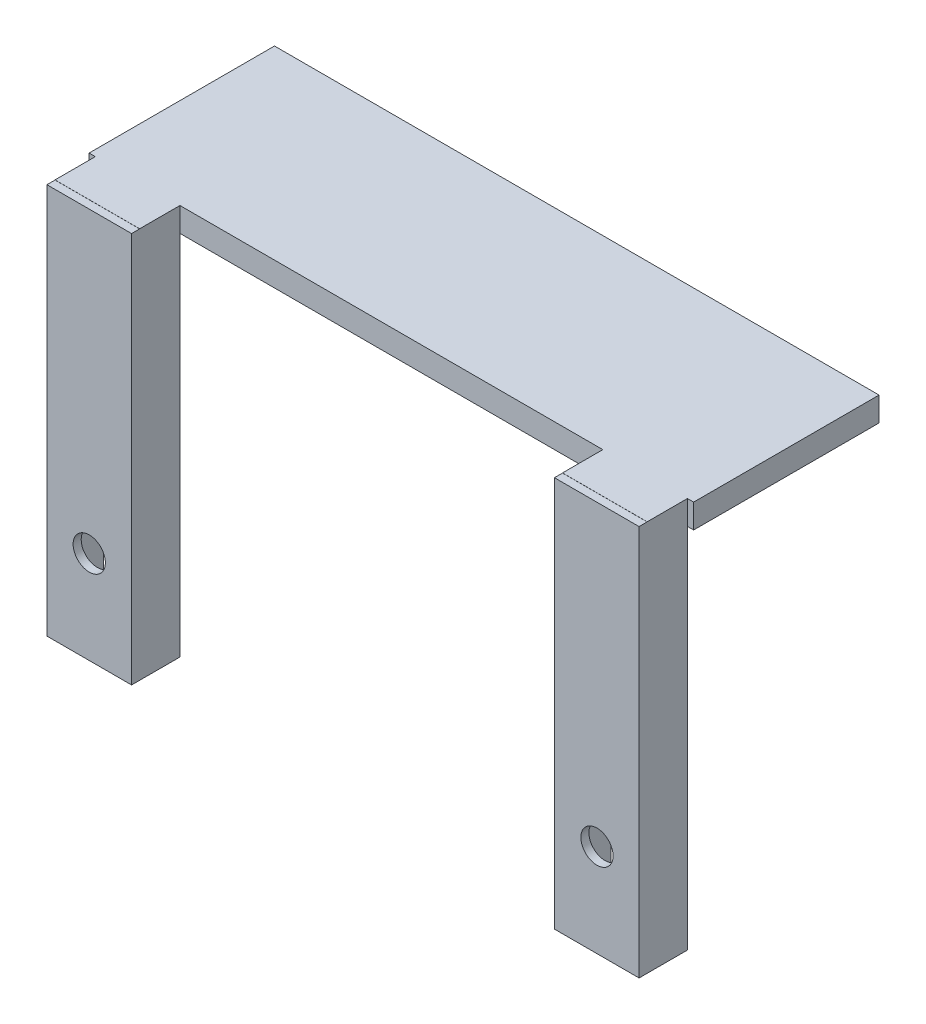
ISO-10303-21;
HEADER;
FILE_DESCRIPTION(('STEP AP214'),'2;1');
FILE_NAME('part.step','',(''),(''),'','','');
FILE_SCHEMA(('AUTOMOTIVE_DESIGN { 1 0 10303 214 1 1 1 1 }'));
ENDSEC;
DATA;
#1=APPLICATION_CONTEXT('core data for automotive mechanical design processes');
#2=APPLICATION_PROTOCOL_DEFINITION('international standard','automotive_design',2000,#1);
#3=PRODUCT_CONTEXT('',#1,'mechanical');
#4=PRODUCT('Part','Part','',(#3));
#5=PRODUCT_RELATED_PRODUCT_CATEGORY('part','',(#4));
#6=PRODUCT_DEFINITION_FORMATION('','',#4);
#7=PRODUCT_DEFINITION_CONTEXT('part definition',#1,'design');
#8=PRODUCT_DEFINITION('design','',#6,#7);
#9=PRODUCT_DEFINITION_SHAPE('','',#8);
#10=(LENGTH_UNIT() NAMED_UNIT(*) SI_UNIT(.MILLI.,.METRE.));
#11=(NAMED_UNIT(*) PLANE_ANGLE_UNIT() SI_UNIT($,.RADIAN.));
#12=(NAMED_UNIT(*) SI_UNIT($,.STERADIAN.) SOLID_ANGLE_UNIT());
#13=UNCERTAINTY_MEASURE_WITH_UNIT(LENGTH_MEASURE(1.E-05),#10,'distance_accuracy_value','');
#14=(GEOMETRIC_REPRESENTATION_CONTEXT(3) GLOBAL_UNCERTAINTY_ASSIGNED_CONTEXT((#13)) GLOBAL_UNIT_ASSIGNED_CONTEXT((#10,
#11,#12)) REPRESENTATION_CONTEXT('',''));
#15=CARTESIAN_POINT('',(0.,0.,0.));
#16=DIRECTION('',(0.,0.,1.));
#17=DIRECTION('',(1.,0.,0.));
#18=AXIS2_PLACEMENT_3D('',#15,#16,#17);
#19=CARTESIAN_POINT('',(0.,0.,16.5));
#20=DIRECTION('',(0.,0.,1.));
#21=DIRECTION('',(1.,0.,0.));
#22=AXIS2_PLACEMENT_3D('',#19,#20,#21);
#23=PLANE('',#22);
#24=DIRECTION('',(0.,-1.,0.));
#25=VECTOR('',#24,1.);
#26=CARTESIAN_POINT('',(26.2302574308606,-45.51489046248,16.5));
#27=LINE('',#26,#25);
#28=CARTESIAN_POINT('',(26.2302574308606,3.00000000000037,16.5));
#29=VERTEX_POINT('',#28);
#30=CARTESIAN_POINT('',(26.2302574308606,2.98510953751964,16.5));
#31=VERTEX_POINT('',#30);
#32=EDGE_CURVE('E64',#29,#31,#27,.T.);
#33=ORIENTED_EDGE('',*,*,#32,.T.);
#34=DIRECTION('',(1.,0.,0.));
#35=VECTOR('',#34,1.);
#36=CARTESIAN_POINT('',(26.2302574308606,2.98510953751964,16.5));
#37=LINE('',#36,#35);
#38=CARTESIAN_POINT('',(36.7302574308606,2.98510953751964,16.5));
#39=VERTEX_POINT('',#38);
#40=EDGE_CURVE('E68',#31,#39,#37,.T.);
#41=ORIENTED_EDGE('',*,*,#40,.T.);
#42=DIRECTION('',(0.,1.,0.));
#43=VECTOR('',#42,1.);
#44=CARTESIAN_POINT('',(36.7302574308606,3.00000000000037,16.5));
#45=LINE('',#44,#43);
#46=CARTESIAN_POINT('',(36.7302574308606,3.00000000000037,16.5));
#47=VERTEX_POINT('',#46);
#48=EDGE_CURVE('E428',#39,#47,#45,.T.);
#49=ORIENTED_EDGE('',*,*,#48,.T.);
#50=DIRECTION('',(-1.,0.,0.));
#51=VECTOR('',#50,1.);
#52=CARTESIAN_POINT('',(26.2302574308606,3.00000000000037,16.5));
#53=LINE('',#52,#51);
#54=EDGE_CURVE('E425',#47,#29,#53,.T.);
#55=ORIENTED_EDGE('',*,*,#54,.T.);
#56=EDGE_LOOP('',(#33,#41,#49,#55));
#57=FACE_BOUND('',#56,.T.);
#58=ADVANCED_FACE('F45',(#57),#23,.T.);
#59=CARTESIAN_POINT('',(0.,0.,16.5));
#60=DIRECTION('',(0.,0.,-1.));
#61=DIRECTION('',(-1.,0.,0.));
#62=AXIS2_PLACEMENT_3D('',#59,#60,#61);
#63=PLANE('',#62);
#64=DIRECTION('',(1.,0.,0.));
#65=VECTOR('',#64,1.);
#66=CARTESIAN_POINT('',(-36.73025743086,2.98510953751964,16.5));
#67=LINE('',#66,#65);
#68=CARTESIAN_POINT('',(-36.73025743086,2.98510953751964,16.5));
#69=VERTEX_POINT('',#68);
#70=CARTESIAN_POINT('',(-26.23025743086,2.98510953751964,16.5));
#71=VERTEX_POINT('',#70);
#72=EDGE_CURVE('E244',#69,#71,#67,.T.);
#73=ORIENTED_EDGE('',*,*,#72,.T.);
#74=DIRECTION('',(0.,1.,0.));
#75=VECTOR('',#74,1.);
#76=CARTESIAN_POINT('',(-26.23025743086,-45.5148904624804,16.5));
#77=LINE('',#76,#75);
#78=CARTESIAN_POINT('',(-26.23025743086,3.,16.5));
#79=VERTEX_POINT('',#78);
#80=EDGE_CURVE('E240',#71,#79,#77,.T.);
#81=ORIENTED_EDGE('',*,*,#80,.T.);
#82=DIRECTION('',(-1.,0.,0.));
#83=VECTOR('',#82,1.);
#84=CARTESIAN_POINT('',(-26.23025743086,3.,16.5));
#85=LINE('',#84,#83);
#86=CARTESIAN_POINT('',(-36.73025743086,3.,16.5));
#87=VERTEX_POINT('',#86);
#88=EDGE_CURVE('E309',#79,#87,#85,.T.);
#89=ORIENTED_EDGE('',*,*,#88,.T.);
#90=DIRECTION('',(0.,-1.,0.));
#91=VECTOR('',#90,1.);
#92=CARTESIAN_POINT('',(-36.73025743086,3.,16.5));
#93=LINE('',#92,#91);
#94=EDGE_CURVE('E312',#87,#69,#93,.T.);
#95=ORIENTED_EDGE('',*,*,#94,.T.);
#96=EDGE_LOOP('',(#73,#81,#89,#95));
#97=FACE_BOUND('',#96,.T.);
#98=ADVANCED_FACE('F540',(#97),#63,.F.);
#99=CARTESIAN_POINT('',(-37.5,3.,11.5));
#100=DIRECTION('',(0.,0.,-1.));
#101=DIRECTION('',(-1.,0.,0.));
#102=AXIS2_PLACEMENT_3D('',#99,#100,#101);
#103=PLANE('',#102);
#104=DIRECTION('',(0.,-1.,0.));
#105=VECTOR('',#104,1.);
#106=CARTESIAN_POINT('',(-36.73025743086,3.,11.5));
#107=LINE('',#106,#105);
#108=CARTESIAN_POINT('',(-36.73025743086,3.,11.5));
#109=VERTEX_POINT('',#108);
#110=CARTESIAN_POINT('',(-36.73025743086,0.,11.5));
#111=VERTEX_POINT('',#110);
#112=EDGE_CURVE('E329',#109,#111,#107,.T.);
#113=ORIENTED_EDGE('',*,*,#112,.F.);
#114=DIRECTION('',(1.,0.,0.));
#115=VECTOR('',#114,1.);
#116=CARTESIAN_POINT('',(-37.5,3.,11.5));
#117=LINE('',#116,#115);
#118=CARTESIAN_POINT('',(-37.5,3.,11.5));
#119=VERTEX_POINT('',#118);
#120=EDGE_CURVE('E450',#119,#109,#117,.T.);
#121=ORIENTED_EDGE('',*,*,#120,.F.);
#122=DIRECTION('',(0.,-1.,0.));
#123=VECTOR('',#122,1.);
#124=CARTESIAN_POINT('',(-37.5,3.,11.5));
#125=LINE('',#124,#123);
#126=CARTESIAN_POINT('',(-37.5,0.,11.5));
#127=VERTEX_POINT('',#126);
#128=EDGE_CURVE('E473',#119,#127,#125,.T.);
#129=ORIENTED_EDGE('',*,*,#128,.T.);
#130=DIRECTION('',(1.,0.,0.));
#131=VECTOR('',#130,1.);
#132=CARTESIAN_POINT('',(-37.5,0.,11.5));
#133=LINE('',#132,#131);
#134=EDGE_CURVE('E443',#127,#111,#133,.T.);
#135=ORIENTED_EDGE('',*,*,#134,.T.);
#136=EDGE_LOOP('',(#113,#121,#129,#135));
#137=FACE_BOUND('',#136,.T.);
#138=ADVANCED_FACE('F633',(#137),#103,.F.);
#139=DIRECTION('',(0.,1.,0.));
#140=VECTOR('',#139,1.);
#141=CARTESIAN_POINT('',(-26.23025743086,-45.5148904624804,11.5));
#142=LINE('',#141,#140);
#143=CARTESIAN_POINT('',(-26.23025743086,0.,11.5));
#144=VERTEX_POINT('',#143);
#145=CARTESIAN_POINT('',(-26.23025743086,3.,11.5));
#146=VERTEX_POINT('',#145);
#147=EDGE_CURVE('E11',#144,#146,#142,.T.);
#148=ORIENTED_EDGE('',*,*,#147,.F.);
#149=CARTESIAN_POINT('',(26.2302574308606,0.,11.5));
#150=VERTEX_POINT('',#149);
#151=EDGE_CURVE('E522',#144,#150,#133,.T.);
#152=ORIENTED_EDGE('',*,*,#151,.T.);
#153=DIRECTION('',(0.,-1.,0.));
#154=VECTOR('',#153,1.);
#155=CARTESIAN_POINT('',(26.2302574308606,-45.51489046248,11.5));
#156=LINE('',#155,#154);
#157=CARTESIAN_POINT('',(26.2302574308606,3.,11.5));
#158=VERTEX_POINT('',#157);
#159=EDGE_CURVE('E407',#158,#150,#156,.T.);
#160=ORIENTED_EDGE('',*,*,#159,.F.);
#161=EDGE_CURVE('E455',#146,#158,#117,.T.);
#162=ORIENTED_EDGE('',*,*,#161,.F.);
#163=EDGE_LOOP('',(#148,#152,#160,#162));
#164=FACE_BOUND('',#163,.T.);
#165=ADVANCED_FACE('F642',(#164),#103,.F.);
#166=DIRECTION('',(0.,1.,0.));
#167=VECTOR('',#166,1.);
#168=CARTESIAN_POINT('',(36.7302574308606,3.00000000000037,11.5));
#169=LINE('',#168,#167);
#170=CARTESIAN_POINT('',(36.7302574308606,0.,11.5));
#171=VERTEX_POINT('',#170);
#172=CARTESIAN_POINT('',(36.7302574308606,3.00000000000037,11.5));
#173=VERTEX_POINT('',#172);
#174=EDGE_CURVE('E55',#171,#173,#169,.T.);
#175=ORIENTED_EDGE('',*,*,#174,.F.);
#176=CARTESIAN_POINT('',(37.5,0.,11.5));
#177=VERTEX_POINT('',#176);
#178=EDGE_CURVE('E465',#171,#177,#133,.T.);
#179=ORIENTED_EDGE('',*,*,#178,.T.);
#180=DIRECTION('',(0.,-1.,0.));
#181=VECTOR('',#180,1.);
#182=CARTESIAN_POINT('',(37.5,3.,11.5));
#183=LINE('',#182,#181);
#184=CARTESIAN_POINT('',(37.5,3.,11.5));
#185=VERTEX_POINT('',#184);
#186=EDGE_CURVE('E454',#185,#177,#183,.T.);
#187=ORIENTED_EDGE('',*,*,#186,.F.);
#188=EDGE_CURVE('E449',#173,#185,#117,.T.);
#189=ORIENTED_EDGE('',*,*,#188,.F.);
#190=EDGE_LOOP('',(#175,#179,#187,#189));
#191=FACE_BOUND('',#190,.T.);
#192=ADVANCED_FACE('F523',(#191),#103,.F.);
#193=CARTESIAN_POINT('',(37.5,3.,11.5));
#194=DIRECTION('',(-1.,0.,0.));
#195=DIRECTION('',(0.,0.,1.));
#196=AXIS2_PLACEMENT_3D('',#193,#194,#195);
#197=PLANE('',#196);
#198=DIRECTION('',(0.,0.,-1.));
#199=VECTOR('',#198,1.);
#200=CARTESIAN_POINT('',(37.5,0.,11.5));
#201=LINE('',#200,#199);
#202=CARTESIAN_POINT('',(37.5,0.,-11.5));
#203=VERTEX_POINT('',#202);
#204=EDGE_CURVE('E365',#177,#203,#201,.T.);
#205=ORIENTED_EDGE('',*,*,#204,.T.);
#206=DIRECTION('',(0.,-1.,0.));
#207=VECTOR('',#206,1.);
#208=CARTESIAN_POINT('',(37.5,3.,-11.5));
#209=LINE('',#208,#207);
#210=CARTESIAN_POINT('',(37.5,3.,-11.5));
#211=VERTEX_POINT('',#210);
#212=EDGE_CURVE('E49',#211,#203,#209,.T.);
#213=ORIENTED_EDGE('',*,*,#212,.F.);
#214=DIRECTION('',(0.,0.,-1.));
#215=VECTOR('',#214,1.);
#216=CARTESIAN_POINT('',(37.5,3.,11.5));
#217=LINE('',#216,#215);
#218=EDGE_CURVE('E438',#185,#211,#217,.T.);
#219=ORIENTED_EDGE('',*,*,#218,.F.);
#220=ORIENTED_EDGE('',*,*,#186,.T.);
#221=EDGE_LOOP('',(#205,#213,#219,#220));
#222=FACE_BOUND('',#221,.T.);
#223=ADVANCED_FACE('F47',(#222),#197,.F.);
#224=CARTESIAN_POINT('',(-37.5,3.,-11.5));
#225=DIRECTION('',(0.,0.,1.));
#226=DIRECTION('',(1.,0.,0.));
#227=AXIS2_PLACEMENT_3D('',#224,#225,#226);
#228=PLANE('',#227);
#229=DIRECTION('',(-1.,0.,0.));
#230=VECTOR('',#229,1.);
#231=CARTESIAN_POINT('',(-37.5,0.,-11.5));
#232=LINE('',#231,#230);
#233=CARTESIAN_POINT('',(-37.5,0.,-11.5));
#234=VERTEX_POINT('',#233);
#235=EDGE_CURVE('E459',#203,#234,#232,.T.);
#236=ORIENTED_EDGE('',*,*,#235,.T.);
#237=DIRECTION('',(0.,-1.,0.));
#238=VECTOR('',#237,1.);
#239=CARTESIAN_POINT('',(-37.5,3.,-11.5));
#240=LINE('',#239,#238);
#241=CARTESIAN_POINT('',(-37.5,3.,-11.5));
#242=VERTEX_POINT('',#241);
#243=EDGE_CURVE('E476',#242,#234,#240,.T.);
#244=ORIENTED_EDGE('',*,*,#243,.F.);
#245=DIRECTION('',(-1.,0.,0.));
#246=VECTOR('',#245,1.);
#247=CARTESIAN_POINT('',(-37.5,3.,-11.5));
#248=LINE('',#247,#246);
#249=EDGE_CURVE('E442',#211,#242,#248,.T.);
#250=ORIENTED_EDGE('',*,*,#249,.F.);
#251=ORIENTED_EDGE('',*,*,#212,.T.);
#252=EDGE_LOOP('',(#236,#244,#250,#251));
#253=FACE_BOUND('',#252,.T.);
#254=ADVANCED_FACE('F529',(#253),#228,.F.);
#255=CARTESIAN_POINT('',(-37.5,3.,11.5));
#256=DIRECTION('',(1.,0.,0.));
#257=DIRECTION('',(0.,0.,-1.));
#258=AXIS2_PLACEMENT_3D('',#255,#256,#257);
#259=PLANE('',#258);
#260=DIRECTION('',(0.,0.,1.));
#261=VECTOR('',#260,1.);
#262=CARTESIAN_POINT('',(-37.5,0.,11.5));
#263=LINE('',#262,#261);
#264=EDGE_CURVE('E462',#234,#127,#263,.T.);
#265=ORIENTED_EDGE('',*,*,#264,.T.);
#266=ORIENTED_EDGE('',*,*,#128,.F.);
#267=DIRECTION('',(0.,0.,1.));
#268=VECTOR('',#267,1.);
#269=CARTESIAN_POINT('',(-37.5,3.,11.5));
#270=LINE('',#269,#268);
#271=EDGE_CURVE('E446',#242,#119,#270,.T.);
#272=ORIENTED_EDGE('',*,*,#271,.F.);
#273=ORIENTED_EDGE('',*,*,#243,.T.);
#274=EDGE_LOOP('',(#265,#266,#272,#273));
#275=FACE_BOUND('',#274,.T.);
#276=ADVANCED_FACE('F531',(#275),#259,.F.);
#277=CARTESIAN_POINT('',(0.,3.,0.));
#278=DIRECTION('',(0.,-1.,0.));
#279=DIRECTION('',(0.,0.,-1.));
#280=AXIS2_PLACEMENT_3D('',#277,#278,#279);
#281=PLANE('',#280);
#282=ORIENTED_EDGE('',*,*,#218,.T.);
#283=ORIENTED_EDGE('',*,*,#249,.T.);
#284=ORIENTED_EDGE('',*,*,#271,.T.);
#285=ORIENTED_EDGE('',*,*,#120,.T.);
#286=DIRECTION('',(0.,0.,-1.));
#287=VECTOR('',#286,1.);
#288=CARTESIAN_POINT('',(-36.73025743086,3.,16.5));
#289=LINE('',#288,#287);
#290=EDGE_CURVE('E342',#87,#109,#289,.T.);
#291=ORIENTED_EDGE('',*,*,#290,.F.);
#292=ORIENTED_EDGE('',*,*,#88,.F.);
#293=DIRECTION('',(0.,0.,-1.));
#294=VECTOR('',#293,1.);
#295=CARTESIAN_POINT('',(-26.23025743086,3.,16.5));
#296=LINE('',#295,#294);
#297=EDGE_CURVE('E346',#79,#146,#296,.T.);
#298=ORIENTED_EDGE('',*,*,#297,.T.);
#299=ORIENTED_EDGE('',*,*,#161,.T.);
#300=DIRECTION('',(0.,0.,-1.));
#301=VECTOR('',#300,1.);
#302=CARTESIAN_POINT('',(26.2302574308606,3.00000000000037,16.5));
#303=LINE('',#302,#301);
#304=EDGE_CURVE('E381',#29,#158,#303,.T.);
#305=ORIENTED_EDGE('',*,*,#304,.F.);
#306=ORIENTED_EDGE('',*,*,#54,.F.);
#307=DIRECTION('',(0.,0.,-1.));
#308=VECTOR('',#307,1.);
#309=CARTESIAN_POINT('',(36.7302574308606,3.00000000000037,16.5));
#310=LINE('',#309,#308);
#311=EDGE_CURVE('E377',#47,#173,#310,.T.);
#312=ORIENTED_EDGE('',*,*,#311,.T.);
#313=ORIENTED_EDGE('',*,*,#188,.T.);
#314=EDGE_LOOP('',(#282,#283,#284,#285,#291,#292,#298,#299,#305,#306,#312,#313));
#315=FACE_BOUND('',#314,.T.);
#316=ADVANCED_FACE('F497',(#315),#281,.F.);
#317=CARTESIAN_POINT('',(0.,0.,0.));
#318=DIRECTION('',(0.,-1.,0.));
#319=DIRECTION('',(0.,0.,-1.));
#320=AXIS2_PLACEMENT_3D('',#317,#318,#319);
#321=PLANE('',#320);
#322=ORIENTED_EDGE('',*,*,#204,.F.);
#323=ORIENTED_EDGE('',*,*,#178,.F.);
#324=CARTESIAN_POINT('',(35.7302574308606,0.,11.5));
#325=VERTEX_POINT('',#324);
#326=EDGE_CURVE('E515',#325,#171,#133,.T.);
#327=ORIENTED_EDGE('',*,*,#326,.F.);
#328=DIRECTION('',(0.,0.,-1.));
#329=VECTOR('',#328,1.);
#330=CARTESIAN_POINT('',(35.7302574308606,3.82506526452886E-13,16.5));
#331=LINE('',#330,#329);
#332=CARTESIAN_POINT('',(35.7302574308606,3.82506526452886E-13,16.5));
#333=VERTEX_POINT('',#332);
#334=EDGE_CURVE('E262',#333,#325,#331,.T.);
#335=ORIENTED_EDGE('',*,*,#334,.F.);
#336=DIRECTION('',(1.,0.,0.));
#337=VECTOR('',#336,1.);
#338=CARTESIAN_POINT('',(35.7302574308606,3.82506526452886E-13,16.5));
#339=LINE('',#338,#337);
#340=CARTESIAN_POINT('',(27.2302574308606,3.82506526452886E-13,16.5));
#341=VERTEX_POINT('',#340);
#342=EDGE_CURVE('E403',#341,#333,#339,.T.);
#343=ORIENTED_EDGE('',*,*,#342,.F.);
#344=DIRECTION('',(0.,0.,-1.));
#345=VECTOR('',#344,1.);
#346=CARTESIAN_POINT('',(27.2302574308606,3.82506526452886E-13,16.5));
#347=LINE('',#346,#345);
#348=CARTESIAN_POINT('',(27.2302574308606,0.,11.5));
#349=VERTEX_POINT('',#348);
#350=EDGE_CURVE('E393',#341,#349,#347,.T.);
#351=ORIENTED_EDGE('',*,*,#350,.T.);
#352=EDGE_CURVE('E519',#150,#349,#133,.T.);
#353=ORIENTED_EDGE('',*,*,#352,.F.);
#354=ORIENTED_EDGE('',*,*,#151,.F.);
#355=CARTESIAN_POINT('',(-27.23025743086,0.,11.5));
#356=VERTEX_POINT('',#355);
#357=EDGE_CURVE('E587',#356,#144,#133,.T.);
#358=ORIENTED_EDGE('',*,*,#357,.F.);
#359=DIRECTION('',(0.,0.,-1.));
#360=VECTOR('',#359,1.);
#361=CARTESIAN_POINT('',(-27.23025743086,0.,16.5));
#362=LINE('',#361,#360);
#363=CARTESIAN_POINT('',(-27.23025743086,0.,16.5));
#364=VERTEX_POINT('',#363);
#365=EDGE_CURVE('E357',#364,#356,#362,.T.);
#366=ORIENTED_EDGE('',*,*,#365,.F.);
#367=DIRECTION('',(1.,0.,0.));
#368=VECTOR('',#367,1.);
#369=CARTESIAN_POINT('',(-35.73025743086,0.,16.5));
#370=LINE('',#369,#368);
#371=CARTESIAN_POINT('',(-35.73025743086,0.,16.5));
#372=VERTEX_POINT('',#371);
#373=EDGE_CURVE('E298',#372,#364,#370,.T.);
#374=ORIENTED_EDGE('',*,*,#373,.F.);
#375=DIRECTION('',(0.,0.,-1.));
#376=VECTOR('',#375,1.);
#377=CARTESIAN_POINT('',(-35.73025743086,0.,16.5));
#378=LINE('',#377,#376);
#379=CARTESIAN_POINT('',(-35.73025743086,0.,11.5));
#380=VERTEX_POINT('',#379);
#381=EDGE_CURVE('E361',#372,#380,#378,.T.);
#382=ORIENTED_EDGE('',*,*,#381,.T.);
#383=EDGE_CURVE('E469',#111,#380,#133,.T.);
#384=ORIENTED_EDGE('',*,*,#383,.F.);
#385=ORIENTED_EDGE('',*,*,#134,.F.);
#386=ORIENTED_EDGE('',*,*,#264,.F.);
#387=ORIENTED_EDGE('',*,*,#235,.F.);
#388=EDGE_LOOP('',(#322,#323,#327,#335,#343,#351,#353,#354,#358,#366,#374,#382,#384,#385,#386,#387));
#389=FACE_BOUND('',#388,.T.);
#390=ADVANCED_FACE('F527',(#389),#321,.T.);
#391=CARTESIAN_POINT('',(0.,0.,11.5));
#392=DIRECTION('',(0.,0.,1.));
#393=DIRECTION('',(1.,0.,0.));
#394=AXIS2_PLACEMENT_3D('',#391,#392,#393);
#395=PLANE('',#394);
#396=CARTESIAN_POINT('',(26.2302574308606,-45.51489046248,11.5));
#397=VERTEX_POINT('',#396);
#398=EDGE_CURVE('E406',#150,#397,#156,.T.);
#399=ORIENTED_EDGE('',*,*,#398,.F.);
#400=ORIENTED_EDGE('',*,*,#352,.T.);
#401=DIRECTION('',(0.,1.,0.));
#402=VECTOR('',#401,1.);
#403=CARTESIAN_POINT('',(27.2302574308606,3.82506526452886E-13,11.5));
#404=LINE('',#403,#402);
#405=CARTESIAN_POINT('',(27.2302574308606,-45.51489046248,11.5));
#406=VERTEX_POINT('',#405);
#407=EDGE_CURVE('E398',#406,#349,#404,.T.);
#408=ORIENTED_EDGE('',*,*,#407,.F.);
#409=DIRECTION('',(1.,0.,0.));
#410=VECTOR('',#409,1.);
#411=CARTESIAN_POINT('',(27.2302574308606,-45.51489046248,11.5));
#412=LINE('',#411,#410);
#413=EDGE_CURVE('E402',#397,#406,#412,.T.);
#414=ORIENTED_EDGE('',*,*,#413,.F.);
#415=EDGE_LOOP('',(#399,#400,#408,#414));
#416=FACE_BOUND('',#415,.T.);
#417=ADVANCED_FACE('F607',(#416),#395,.F.);
#418=DIRECTION('',(0.,-1.,0.));
#419=VECTOR('',#418,1.);
#420=CARTESIAN_POINT('',(35.7302574308606,-45.5148904624799,11.5));
#421=LINE('',#420,#419);
#422=CARTESIAN_POINT('',(35.7302574308606,-45.5148904624799,11.5));
#423=VERTEX_POINT('',#422);
#424=EDGE_CURVE('E321',#325,#423,#421,.T.);
#425=ORIENTED_EDGE('',*,*,#424,.F.);
#426=ORIENTED_EDGE('',*,*,#326,.T.);
#427=CARTESIAN_POINT('',(36.7302574308606,-45.5148904624798,11.5));
#428=VERTEX_POINT('',#427);
#429=EDGE_CURVE('E411',#428,#171,#169,.T.);
#430=ORIENTED_EDGE('',*,*,#429,.F.);
#431=DIRECTION('',(1.,0.,0.));
#432=VECTOR('',#431,1.);
#433=CARTESIAN_POINT('',(35.7302574308606,-45.5148904624799,11.5));
#434=LINE('',#433,#432);
#435=EDGE_CURVE('E415',#423,#428,#434,.T.);
#436=ORIENTED_EDGE('',*,*,#435,.F.);
#437=EDGE_LOOP('',(#425,#426,#430,#436));
#438=FACE_BOUND('',#437,.T.);
#439=ADVANCED_FACE('F514',(#438),#395,.F.);
#440=CARTESIAN_POINT('',(35.7302574308606,-45.5148904624799,16.5));
#441=DIRECTION('',(1.,0.,0.));
#442=DIRECTION('',(0.,0.,-1.));
#443=AXIS2_PLACEMENT_3D('',#440,#441,#442);
#444=PLANE('',#443);
#445=ORIENTED_EDGE('',*,*,#424,.T.);
#446=DIRECTION('',(0.,0.,-1.));
#447=VECTOR('',#446,1.);
#448=CARTESIAN_POINT('',(35.7302574308606,-45.5148904624799,16.5));
#449=LINE('',#448,#447);
#450=CARTESIAN_POINT('',(35.7302574308606,-45.5148904624799,16.5));
#451=VERTEX_POINT('',#450);
#452=EDGE_CURVE('E369',#451,#423,#449,.T.);
#453=ORIENTED_EDGE('',*,*,#452,.F.);
#454=DIRECTION('',(0.,-1.,0.));
#455=VECTOR('',#454,1.);
#456=CARTESIAN_POINT('',(35.7302574308606,-45.5148904624799,16.5));
#457=LINE('',#456,#455);
#458=EDGE_CURVE('E431',#333,#451,#457,.T.);
#459=ORIENTED_EDGE('',*,*,#458,.F.);
#460=ORIENTED_EDGE('',*,*,#334,.T.);
#461=EDGE_LOOP('',(#445,#453,#459,#460));
#462=FACE_BOUND('',#461,.T.);
#463=ADVANCED_FACE('F616',(#462),#444,.F.);
#464=CARTESIAN_POINT('',(35.7302574308606,-45.5148904624799,16.5));
#465=DIRECTION('',(0.,1.,0.));
#466=DIRECTION('',(-1.,0.,0.));
#467=AXIS2_PLACEMENT_3D('',#464,#465,#466);
#468=PLANE('',#467);
#469=ORIENTED_EDGE('',*,*,#435,.T.);
#470=DIRECTION('',(0.,0.,-1.));
#471=VECTOR('',#470,1.);
#472=CARTESIAN_POINT('',(36.7302574308606,-45.5148904624798,16.5));
#473=LINE('',#472,#471);
#474=CARTESIAN_POINT('',(36.7302574308606,-45.5148904624804,17.5));
#475=VERTEX_POINT('',#474);
#476=EDGE_CURVE('E373',#475,#428,#473,.T.);
#477=ORIENTED_EDGE('',*,*,#476,.F.);
#478=DIRECTION('',(-1.,0.,0.));
#479=VECTOR('',#478,1.);
#480=CARTESIAN_POINT('',(36.7302574308606,-45.5148904624804,17.5));
#481=LINE('',#480,#479);
#482=CARTESIAN_POINT('',(26.2302574308606,-45.5148904624804,17.5));
#483=VERTEX_POINT('',#482);
#484=EDGE_CURVE('E274',#475,#483,#481,.T.);
#485=ORIENTED_EDGE('',*,*,#484,.T.);
#486=DIRECTION('',(0.,0.,-1.));
#487=VECTOR('',#486,1.);
#488=CARTESIAN_POINT('',(26.2302574308606,-45.51489046248,16.5));
#489=LINE('',#488,#487);
#490=EDGE_CURVE('E385',#483,#397,#489,.T.);
#491=ORIENTED_EDGE('',*,*,#490,.T.);
#492=ORIENTED_EDGE('',*,*,#413,.T.);
#493=DIRECTION('',(0.,0.,-1.));
#494=VECTOR('',#493,1.);
#495=CARTESIAN_POINT('',(27.2302574308606,-45.51489046248,16.5));
#496=LINE('',#495,#494);
#497=CARTESIAN_POINT('',(27.2302574308606,-45.51489046248,16.5));
#498=VERTEX_POINT('',#497);
#499=EDGE_CURVE('E389',#498,#406,#496,.T.);
#500=ORIENTED_EDGE('',*,*,#499,.F.);
#501=DIRECTION('',(1.,0.,0.));
#502=VECTOR('',#501,1.);
#503=CARTESIAN_POINT('',(26.2302574308606,-45.5148904624804,16.5));
#504=LINE('',#503,#502);
#505=EDGE_CURVE('E258',#498,#451,#504,.T.);
#506=ORIENTED_EDGE('',*,*,#505,.T.);
#507=ORIENTED_EDGE('',*,*,#452,.T.);
#508=EDGE_LOOP('',(#469,#477,#485,#491,#492,#500,#506,#507));
#509=FACE_BOUND('',#508,.T.);
#510=ADVANCED_FACE('F604',(#509),#468,.F.);
#511=CARTESIAN_POINT('',(36.7302574308606,3.00000000000037,16.5));
#512=DIRECTION('',(-1.,0.,0.));
#513=DIRECTION('',(0.,0.,1.));
#514=AXIS2_PLACEMENT_3D('',#511,#512,#513);
#515=PLANE('',#514);
#516=ORIENTED_EDGE('',*,*,#429,.T.);
#517=ORIENTED_EDGE('',*,*,#174,.T.);
#518=ORIENTED_EDGE('',*,*,#311,.F.);
#519=ORIENTED_EDGE('',*,*,#48,.F.);
#520=DIRECTION('',(0.,0.,1.));
#521=VECTOR('',#520,1.);
#522=CARTESIAN_POINT('',(36.7302574308606,2.98510953751964,16.5));
#523=LINE('',#522,#521);
#524=CARTESIAN_POINT('',(36.7302574308606,2.98510953751964,17.5));
#525=VERTEX_POINT('',#524);
#526=EDGE_CURVE('E285',#39,#525,#523,.T.);
#527=ORIENTED_EDGE('',*,*,#526,.T.);
#528=DIRECTION('',(0.,-1.,0.));
#529=VECTOR('',#528,1.);
#530=CARTESIAN_POINT('',(36.7302574308606,2.98510953751964,17.5));
#531=LINE('',#530,#529);
#532=EDGE_CURVE('E264',#525,#475,#531,.T.);
#533=ORIENTED_EDGE('',*,*,#532,.T.);
#534=ORIENTED_EDGE('',*,*,#476,.T.);
#535=EDGE_LOOP('',(#516,#517,#518,#519,#527,#533,#534));
#536=FACE_BOUND('',#535,.T.);
#537=ADVANCED_FACE('F491',(#536),#515,.F.);
#538=CARTESIAN_POINT('',(26.2302574308606,-45.51489046248,16.5));
#539=DIRECTION('',(1.,0.,0.));
#540=DIRECTION('',(0.,0.,-1.));
#541=AXIS2_PLACEMENT_3D('',#538,#539,#540);
#542=PLANE('',#541);
#543=ORIENTED_EDGE('',*,*,#159,.T.);
#544=ORIENTED_EDGE('',*,*,#398,.T.);
#545=ORIENTED_EDGE('',*,*,#490,.F.);
#546=DIRECTION('',(0.,-1.,0.));
#547=VECTOR('',#546,1.);
#548=CARTESIAN_POINT('',(26.2302574308606,2.98510953751964,17.5));
#549=LINE('',#548,#547);
#550=CARTESIAN_POINT('',(26.2302574308606,2.98510953751964,17.5));
#551=VERTEX_POINT('',#550);
#552=EDGE_CURVE('E269',#551,#483,#549,.T.);
#553=ORIENTED_EDGE('',*,*,#552,.F.);
#554=DIRECTION('',(0.,0.,-1.));
#555=VECTOR('',#554,1.);
#556=CARTESIAN_POINT('',(26.2302574308606,2.98510953751964,17.5));
#557=LINE('',#556,#555);
#558=EDGE_CURVE('E278',#551,#31,#557,.T.);
#559=ORIENTED_EDGE('',*,*,#558,.T.);
#560=ORIENTED_EDGE('',*,*,#32,.F.);
#561=ORIENTED_EDGE('',*,*,#304,.T.);
#562=EDGE_LOOP('',(#543,#544,#545,#553,#559,#560,#561));
#563=FACE_BOUND('',#562,.T.);
#564=ADVANCED_FACE('F601',(#563),#542,.F.);
#565=CARTESIAN_POINT('',(27.2302574308606,3.82506526452886E-13,16.5));
#566=DIRECTION('',(-1.,0.,0.));
#567=DIRECTION('',(0.,0.,1.));
#568=AXIS2_PLACEMENT_3D('',#565,#566,#567);
#569=PLANE('',#568);
#570=ORIENTED_EDGE('',*,*,#407,.T.);
#571=ORIENTED_EDGE('',*,*,#350,.F.);
#572=DIRECTION('',(0.,1.,0.));
#573=VECTOR('',#572,1.);
#574=CARTESIAN_POINT('',(27.2302574308606,3.82506526452886E-13,16.5));
#575=LINE('',#574,#573);
#576=EDGE_CURVE('E397',#498,#341,#575,.T.);
#577=ORIENTED_EDGE('',*,*,#576,.F.);
#578=ORIENTED_EDGE('',*,*,#499,.T.);
#579=EDGE_LOOP('',(#570,#571,#577,#578));
#580=FACE_BOUND('',#579,.T.);
#581=ADVANCED_FACE('F609',(#580),#569,.F.);
#582=CARTESIAN_POINT('',(0.,0.,11.5));
#583=DIRECTION('',(0.,0.,-1.));
#584=DIRECTION('',(-1.,0.,0.));
#585=AXIS2_PLACEMENT_3D('',#582,#583,#584);
#586=PLANE('',#585);
#587=CARTESIAN_POINT('',(-36.73025743086,-45.5148904624804,11.5));
#588=VERTEX_POINT('',#587);
#589=EDGE_CURVE('E328',#111,#588,#107,.T.);
#590=ORIENTED_EDGE('',*,*,#589,.F.);
#591=ORIENTED_EDGE('',*,*,#383,.T.);
#592=DIRECTION('',(0.,1.,0.));
#593=VECTOR('',#592,1.);
#594=CARTESIAN_POINT('',(-35.73025743086,-45.5148904624804,11.5));
#595=LINE('',#594,#593);
#596=CARTESIAN_POINT('',(-35.73025743086,-45.5148904624804,11.5));
#597=VERTEX_POINT('',#596);
#598=EDGE_CURVE('E316',#597,#380,#595,.T.);
#599=ORIENTED_EDGE('',*,*,#598,.F.);
#600=DIRECTION('',(1.,0.,0.));
#601=VECTOR('',#600,1.);
#602=CARTESIAN_POINT('',(-35.73025743086,-45.5148904624804,11.5));
#603=LINE('',#602,#601);
#604=EDGE_CURVE('E299',#588,#597,#603,.T.);
#605=ORIENTED_EDGE('',*,*,#604,.F.);
#606=EDGE_LOOP('',(#590,#591,#599,#605));
#607=FACE_BOUND('',#606,.T.);
#608=ADVANCED_FACE('F585',(#607),#586,.T.);
#609=CARTESIAN_POINT('',(-35.73025743086,-45.5148904624804,16.5));
#610=DIRECTION('',(-1.,0.,0.));
#611=DIRECTION('',(0.,0.,1.));
#612=AXIS2_PLACEMENT_3D('',#609,#610,#611);
#613=PLANE('',#612);
#614=ORIENTED_EDGE('',*,*,#598,.T.);
#615=ORIENTED_EDGE('',*,*,#381,.F.);
#616=DIRECTION('',(0.,1.,0.));
#617=VECTOR('',#616,1.);
#618=CARTESIAN_POINT('',(-35.73025743086,-45.5148904624804,16.5));
#619=LINE('',#618,#617);
#620=CARTESIAN_POINT('',(-35.73025743086,-45.5148904624804,16.5));
#621=VERTEX_POINT('',#620);
#622=EDGE_CURVE('E294',#621,#372,#619,.T.);
#623=ORIENTED_EDGE('',*,*,#622,.F.);
#624=DIRECTION('',(0.,0.,-1.));
#625=VECTOR('',#624,1.);
#626=CARTESIAN_POINT('',(-35.73025743086,-45.5148904624804,16.5));
#627=LINE('',#626,#625);
#628=EDGE_CURVE('E315',#621,#597,#627,.T.);
#629=ORIENTED_EDGE('',*,*,#628,.T.);
#630=EDGE_LOOP('',(#614,#615,#623,#629));
#631=FACE_BOUND('',#630,.T.);
#632=ADVANCED_FACE('F578',(#631),#613,.F.);
#633=CARTESIAN_POINT('',(-27.23025743086,0.,16.5));
#634=DIRECTION('',(1.,0.,0.));
#635=DIRECTION('',(0.,0.,-1.));
#636=AXIS2_PLACEMENT_3D('',#633,#634,#635);
#637=PLANE('',#636);
#638=DIRECTION('',(0.,-1.,0.));
#639=VECTOR('',#638,1.);
#640=CARTESIAN_POINT('',(-27.23025743086,0.,11.5));
#641=LINE('',#640,#639);
#642=CARTESIAN_POINT('',(-27.23025743086,-45.5148904624804,11.5));
#643=VERTEX_POINT('',#642);
#644=EDGE_CURVE('E320',#356,#643,#641,.T.);
#645=ORIENTED_EDGE('',*,*,#644,.T.);
#646=DIRECTION('',(0.,0.,-1.));
#647=VECTOR('',#646,1.);
#648=CARTESIAN_POINT('',(-27.23025743086,-45.5148904624804,16.5));
#649=LINE('',#648,#647);
#650=CARTESIAN_POINT('',(-27.23025743086,-45.5148904624804,16.5));
#651=VERTEX_POINT('',#650);
#652=EDGE_CURVE('E353',#651,#643,#649,.T.);
#653=ORIENTED_EDGE('',*,*,#652,.F.);
#654=DIRECTION('',(0.,-1.,0.));
#655=VECTOR('',#654,1.);
#656=CARTESIAN_POINT('',(-27.23025743086,0.,16.5));
#657=LINE('',#656,#655);
#658=EDGE_CURVE('E303',#364,#651,#657,.T.);
#659=ORIENTED_EDGE('',*,*,#658,.F.);
#660=ORIENTED_EDGE('',*,*,#365,.T.);
#661=EDGE_LOOP('',(#645,#653,#659,#660));
#662=FACE_BOUND('',#661,.T.);
#663=ADVANCED_FACE('F593',(#662),#637,.F.);
#664=CARTESIAN_POINT('',(-27.23025743086,-45.5148904624804,16.5));
#665=DIRECTION('',(0.,1.,0.));
#666=DIRECTION('',(0.,0.,1.));
#667=AXIS2_PLACEMENT_3D('',#664,#665,#666);
#668=PLANE('',#667);
#669=DIRECTION('',(1.,0.,0.));
#670=VECTOR('',#669,1.);
#671=CARTESIAN_POINT('',(-27.23025743086,-45.5148904624804,11.5));
#672=LINE('',#671,#670);
#673=CARTESIAN_POINT('',(-26.23025743086,-45.5148904624804,11.5));
#674=VERTEX_POINT('',#673);
#675=EDGE_CURVE('E324',#643,#674,#672,.T.);
#676=ORIENTED_EDGE('',*,*,#675,.T.);
#677=DIRECTION('',(0.,0.,-1.));
#678=VECTOR('',#677,1.);
#679=CARTESIAN_POINT('',(-26.23025743086,-45.5148904624804,16.5));
#680=LINE('',#679,#678);
#681=CARTESIAN_POINT('',(-26.23025743086,-45.5148904624804,17.5));
#682=VERTEX_POINT('',#681);
#683=EDGE_CURVE('E350',#682,#674,#680,.T.);
#684=ORIENTED_EDGE('',*,*,#683,.F.);
#685=DIRECTION('',(-1.,0.,0.));
#686=VECTOR('',#685,1.);
#687=CARTESIAN_POINT('',(-26.23025743086,-45.5148904624804,17.5));
#688=LINE('',#687,#686);
#689=CARTESIAN_POINT('',(-36.73025743086,-45.5148904624804,17.5));
#690=VERTEX_POINT('',#689);
#691=EDGE_CURVE('E228',#682,#690,#688,.T.);
#692=ORIENTED_EDGE('',*,*,#691,.T.);
#693=DIRECTION('',(0.,0.,-1.));
#694=VECTOR('',#693,1.);
#695=CARTESIAN_POINT('',(-36.73025743086,-45.5148904624804,16.5));
#696=LINE('',#695,#694);
#697=EDGE_CURVE('E338',#690,#588,#696,.T.);
#698=ORIENTED_EDGE('',*,*,#697,.T.);
#699=ORIENTED_EDGE('',*,*,#604,.T.);
#700=ORIENTED_EDGE('',*,*,#628,.F.);
#701=DIRECTION('',(1.,0.,0.));
#702=VECTOR('',#701,1.);
#703=CARTESIAN_POINT('',(-36.73025743086,-45.5148904624804,16.5));
#704=LINE('',#703,#702);
#705=EDGE_CURVE('E254',#621,#651,#704,.T.);
#706=ORIENTED_EDGE('',*,*,#705,.T.);
#707=ORIENTED_EDGE('',*,*,#652,.T.);
#708=EDGE_LOOP('',(#676,#684,#692,#698,#699,#700,#706,#707));
#709=FACE_BOUND('',#708,.T.);
#710=ADVANCED_FACE('F581',(#709),#668,.F.);
#711=CARTESIAN_POINT('',(-26.23025743086,-45.5148904624804,16.5));
#712=DIRECTION('',(-1.,0.,0.));
#713=DIRECTION('',(0.,0.,1.));
#714=AXIS2_PLACEMENT_3D('',#711,#712,#713);
#715=PLANE('',#714);
#716=EDGE_CURVE('E57',#674,#144,#142,.T.);
#717=ORIENTED_EDGE('',*,*,#716,.T.);
#718=ORIENTED_EDGE('',*,*,#147,.T.);
#719=ORIENTED_EDGE('',*,*,#297,.F.);
#720=ORIENTED_EDGE('',*,*,#80,.F.);
#721=DIRECTION('',(0.,0.,1.));
#722=VECTOR('',#721,1.);
#723=CARTESIAN_POINT('',(-26.23025743086,2.98510953751964,16.5));
#724=LINE('',#723,#722);
#725=CARTESIAN_POINT('',(-26.23025743086,2.98510953751964,17.5));
#726=VERTEX_POINT('',#725);
#727=EDGE_CURVE('E236',#71,#726,#724,.T.);
#728=ORIENTED_EDGE('',*,*,#727,.T.);
#729=DIRECTION('',(0.,-1.,0.));
#730=VECTOR('',#729,1.);
#731=CARTESIAN_POINT('',(-26.23025743086,2.98510953751964,17.5));
#732=LINE('',#731,#730);
#733=EDGE_CURVE('E221',#726,#682,#732,.T.);
#734=ORIENTED_EDGE('',*,*,#733,.T.);
#735=ORIENTED_EDGE('',*,*,#683,.T.);
#736=EDGE_LOOP('',(#717,#718,#719,#720,#728,#734,#735));
#737=FACE_BOUND('',#736,.T.);
#738=ADVANCED_FACE('F238',(#737),#715,.F.);
#739=CARTESIAN_POINT('',(-36.73025743086,3.,16.5));
#740=DIRECTION('',(1.,0.,0.));
#741=DIRECTION('',(0.,0.,-1.));
#742=AXIS2_PLACEMENT_3D('',#739,#740,#741);
#743=PLANE('',#742);
#744=ORIENTED_EDGE('',*,*,#112,.T.);
#745=ORIENTED_EDGE('',*,*,#589,.T.);
#746=ORIENTED_EDGE('',*,*,#697,.F.);
#747=DIRECTION('',(0.,-1.,0.));
#748=VECTOR('',#747,1.);
#749=CARTESIAN_POINT('',(-36.73025743086,2.98510953751964,17.5));
#750=LINE('',#749,#748);
#751=CARTESIAN_POINT('',(-36.73025743086,2.98510953751964,17.5));
#752=VERTEX_POINT('',#751);
#753=EDGE_CURVE('E232',#752,#690,#750,.T.);
#754=ORIENTED_EDGE('',*,*,#753,.F.);
#755=DIRECTION('',(0.,0.,-1.));
#756=VECTOR('',#755,1.);
#757=CARTESIAN_POINT('',(-36.73025743086,2.98510953751964,17.5));
#758=LINE('',#757,#756);
#759=EDGE_CURVE('E249',#752,#69,#758,.T.);
#760=ORIENTED_EDGE('',*,*,#759,.T.);
#761=ORIENTED_EDGE('',*,*,#94,.F.);
#762=ORIENTED_EDGE('',*,*,#290,.T.);
#763=EDGE_LOOP('',(#744,#745,#746,#754,#760,#761,#762));
#764=FACE_BOUND('',#763,.T.);
#765=ADVANCED_FACE('F538',(#764),#743,.F.);
#766=ORIENTED_EDGE('',*,*,#644,.F.);
#767=ORIENTED_EDGE('',*,*,#357,.T.);
#768=ORIENTED_EDGE('',*,*,#716,.F.);
#769=ORIENTED_EDGE('',*,*,#675,.F.);
#770=EDGE_LOOP('',(#766,#767,#768,#769));
#771=FACE_BOUND('',#770,.T.);
#772=ADVANCED_FACE('F572',(#771),#586,.T.);
#773=CARTESIAN_POINT('',(-36.73025743086,2.98510953751964,16.5));
#774=DIRECTION('',(0.,0.,-1.));
#775=DIRECTION('',(-1.,0.,0.));
#776=AXIS2_PLACEMENT_3D('',#773,#774,#775);
#777=PLANE('',#776);
#778=CARTESIAN_POINT('',(-31.4812581086136,-34.0121498143342,16.5));
#779=DIRECTION('',(0.,0.,-1.));
#780=DIRECTION('',(-1.,0.,0.));
#781=AXIS2_PLACEMENT_3D('',#778,#779,#780);
#782=CIRCLE('',#781,2.00000000000001);
#783=CARTESIAN_POINT('',(-33.4812581086136,-34.0121498143342,16.5));
#784=VERTEX_POINT('',#783);
#785=EDGE_CURVE('E553',#784,#784,#782,.T.);
#786=ORIENTED_EDGE('',*,*,#785,.F.);
#787=EDGE_LOOP('',(#786));
#788=FACE_BOUND('',#787,.T.);
#789=ORIENTED_EDGE('',*,*,#622,.T.);
#790=ORIENTED_EDGE('',*,*,#373,.T.);
#791=ORIENTED_EDGE('',*,*,#658,.T.);
#792=ORIENTED_EDGE('',*,*,#705,.F.);
#793=EDGE_LOOP('',(#789,#790,#791,#792));
#794=FACE_BOUND('',#793,.T.);
#795=ADVANCED_FACE('F569',(#788,#794),#777,.T.);
#796=CARTESIAN_POINT('',(-26.23025743086,2.98510953751964,17.5));
#797=DIRECTION('',(0.,0.,1.));
#798=DIRECTION('',(1.,0.,0.));
#799=AXIS2_PLACEMENT_3D('',#796,#797,#798);
#800=PLANE('',#799);
#801=CARTESIAN_POINT('',(-31.4812581086136,-34.0121498143342,17.5));
#802=DIRECTION('',(0.,0.,-1.));
#803=DIRECTION('',(-1.,0.,0.));
#804=AXIS2_PLACEMENT_3D('',#801,#802,#803);
#805=CIRCLE('',#804,2.00000000000001);
#806=CARTESIAN_POINT('',(-33.4812581086136,-34.0121498143342,17.5));
#807=VERTEX_POINT('',#806);
#808=EDGE_CURVE('E273',#807,#807,#805,.T.);
#809=ORIENTED_EDGE('',*,*,#808,.T.);
#810=EDGE_LOOP('',(#809));
#811=FACE_BOUND('',#810,.T.);
#812=ORIENTED_EDGE('',*,*,#691,.F.);
#813=ORIENTED_EDGE('',*,*,#733,.F.);
#814=DIRECTION('',(-1.,0.,0.));
#815=VECTOR('',#814,1.);
#816=CARTESIAN_POINT('',(-26.23025743086,2.98510953751964,17.5));
#817=LINE('',#816,#815);
#818=EDGE_CURVE('E226',#726,#752,#817,.T.);
#819=ORIENTED_EDGE('',*,*,#818,.T.);
#820=ORIENTED_EDGE('',*,*,#753,.T.);
#821=EDGE_LOOP('',(#812,#813,#819,#820));
#822=FACE_BOUND('',#821,.T.);
#823=ADVANCED_FACE('F223',(#811,#822),#800,.T.);
#824=CARTESIAN_POINT('',(0.,2.98510953751964,0.));
#825=DIRECTION('',(0.,-1.,0.));
#826=DIRECTION('',(0.,0.,-1.));
#827=AXIS2_PLACEMENT_3D('',#824,#825,#826);
#828=PLANE('',#827);
#829=ORIENTED_EDGE('',*,*,#759,.F.);
#830=ORIENTED_EDGE('',*,*,#818,.F.);
#831=ORIENTED_EDGE('',*,*,#727,.F.);
#832=ORIENTED_EDGE('',*,*,#72,.F.);
#833=EDGE_LOOP('',(#829,#830,#831,#832));
#834=FACE_BOUND('',#833,.T.);
#835=ADVANCED_FACE('F247',(#834),#828,.F.);
#836=CARTESIAN_POINT('',(26.2302574308606,2.98510953751964,16.5));
#837=DIRECTION('',(0.,0.,-1.));
#838=DIRECTION('',(-1.,0.,0.));
#839=AXIS2_PLACEMENT_3D('',#836,#837,#838);
#840=PLANE('',#839);
#841=CARTESIAN_POINT('',(31.5034499841653,-34.0148904624804,16.5));
#842=DIRECTION('',(0.,0.,-1.));
#843=DIRECTION('',(-1.,0.,0.));
#844=AXIS2_PLACEMENT_3D('',#841,#842,#843);
#845=CIRCLE('',#844,2.);
#846=CARTESIAN_POINT('',(29.5034499841653,-34.0148904624804,16.5));
#847=VERTEX_POINT('',#846);
#848=EDGE_CURVE('E549',#847,#847,#845,.T.);
#849=ORIENTED_EDGE('',*,*,#848,.F.);
#850=EDGE_LOOP('',(#849));
#851=FACE_BOUND('',#850,.T.);
#852=ORIENTED_EDGE('',*,*,#458,.T.);
#853=ORIENTED_EDGE('',*,*,#505,.F.);
#854=ORIENTED_EDGE('',*,*,#576,.T.);
#855=ORIENTED_EDGE('',*,*,#342,.T.);
#856=EDGE_LOOP('',(#852,#853,#854,#855));
#857=FACE_BOUND('',#856,.T.);
#858=ADVANCED_FACE('F614',(#851,#857),#840,.T.);
#859=CARTESIAN_POINT('',(36.7302574308606,2.98510953751964,17.5));
#860=DIRECTION('',(0.,0.,1.));
#861=DIRECTION('',(1.,0.,0.));
#862=AXIS2_PLACEMENT_3D('',#859,#860,#861);
#863=PLANE('',#862);
#864=CARTESIAN_POINT('',(31.5034499841653,-34.0148904624804,17.5));
#865=DIRECTION('',(0.,0.,-1.));
#866=DIRECTION('',(-1.,0.,0.));
#867=AXIS2_PLACEMENT_3D('',#864,#865,#866);
#868=CIRCLE('',#867,2.);
#869=CARTESIAN_POINT('',(29.5034499841653,-34.0148904624804,17.5));
#870=VERTEX_POINT('',#869);
#871=EDGE_CURVE('E545',#870,#870,#868,.T.);
#872=ORIENTED_EDGE('',*,*,#871,.T.);
#873=EDGE_LOOP('',(#872));
#874=FACE_BOUND('',#873,.T.);
#875=ORIENTED_EDGE('',*,*,#484,.F.);
#876=ORIENTED_EDGE('',*,*,#532,.F.);
#877=DIRECTION('',(-1.,0.,0.));
#878=VECTOR('',#877,1.);
#879=CARTESIAN_POINT('',(36.7302574308606,2.98510953751964,17.5));
#880=LINE('',#879,#878);
#881=EDGE_CURVE('E268',#525,#551,#880,.T.);
#882=ORIENTED_EDGE('',*,*,#881,.T.);
#883=ORIENTED_EDGE('',*,*,#552,.T.);
#884=EDGE_LOOP('',(#875,#876,#882,#883));
#885=FACE_BOUND('',#884,.T.);
#886=ADVANCED_FACE('F508',(#874,#885),#863,.T.);
#887=CARTESIAN_POINT('',(0.,2.98510953751964,0.));
#888=DIRECTION('',(0.,-1.,0.));
#889=DIRECTION('',(0.,0.,-1.));
#890=AXIS2_PLACEMENT_3D('',#887,#888,#889);
#891=PLANE('',#890);
#892=ORIENTED_EDGE('',*,*,#558,.F.);
#893=ORIENTED_EDGE('',*,*,#881,.F.);
#894=ORIENTED_EDGE('',*,*,#526,.F.);
#895=ORIENTED_EDGE('',*,*,#40,.F.);
#896=EDGE_LOOP('',(#892,#893,#894,#895));
#897=FACE_BOUND('',#896,.T.);
#898=ADVANCED_FACE('F505',(#897),#891,.F.);
#899=CARTESIAN_POINT('',(31.5034499841653,-34.0148904624804,17.5));
#900=DIRECTION('',(0.,0.,-1.));
#901=DIRECTION('',(-1.,0.,0.));
#902=AXIS2_PLACEMENT_3D('',#899,#900,#901);
#903=CYLINDRICAL_SURFACE('',#902,2.);
#904=ORIENTED_EDGE('',*,*,#871,.F.);
#905=EDGE_LOOP('',(#904));
#906=FACE_BOUND('',#905,.T.);
#907=ORIENTED_EDGE('',*,*,#848,.T.);
#908=EDGE_LOOP('',(#907));
#909=FACE_BOUND('',#908,.T.);
#910=ADVANCED_FACE('F565',(#906,#909),#903,.F.);
#911=CARTESIAN_POINT('',(-31.4812581086136,-34.0121498143342,17.5));
#912=DIRECTION('',(0.,0.,-1.));
#913=DIRECTION('',(-1.,0.,0.));
#914=AXIS2_PLACEMENT_3D('',#911,#912,#913);
#915=CYLINDRICAL_SURFACE('',#914,2.00000000000001);
#916=ORIENTED_EDGE('',*,*,#808,.F.);
#917=EDGE_LOOP('',(#916));
#918=FACE_BOUND('',#917,.T.);
#919=ORIENTED_EDGE('',*,*,#785,.T.);
#920=EDGE_LOOP('',(#919));
#921=FACE_BOUND('',#920,.T.);
#922=ADVANCED_FACE('F562',(#918,#921),#915,.F.);
#923=CLOSED_SHELL('',(#58,#98,#138,#165,#192,#223,#254,#276,#316,#390,#417,#439,#463,#510,#537,
#564,#581,#608,#632,#663,#710,#738,#765,#772,#795,#823,#835,#858,#886,#898,#910,#922));
#924=MANIFOLD_SOLID_BREP('B2',#923);
#925=ADVANCED_BREP_SHAPE_REPRESENTATION('',(#18,#924),#14);
#926=SHAPE_DEFINITION_REPRESENTATION(#9,#925);
ENDSEC;
END-ISO-10303-21;
